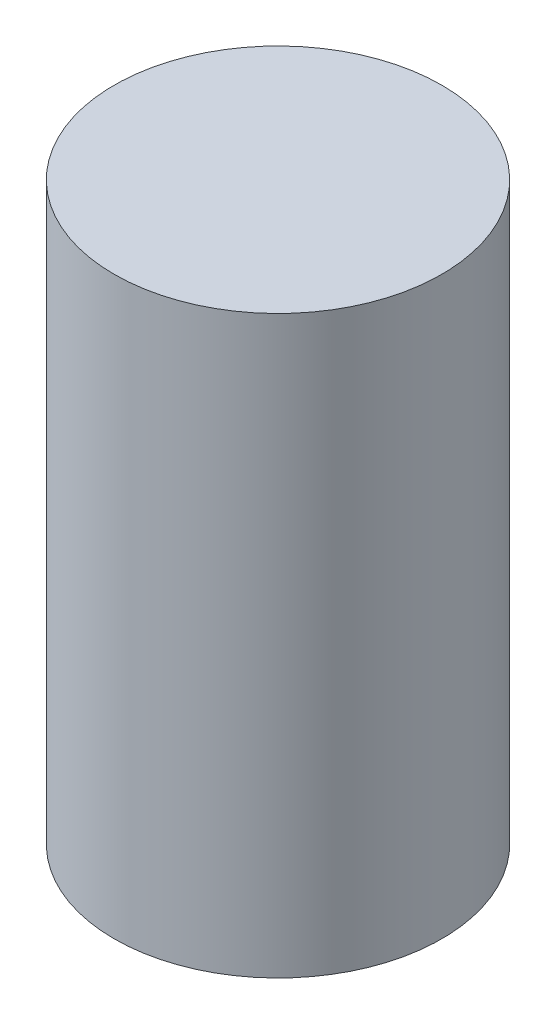
ISO-10303-21;
HEADER;
FILE_DESCRIPTION(('STEP AP214'),'2;1');
FILE_NAME('part.step','',(''),(''),'','','');
FILE_SCHEMA(('AUTOMOTIVE_DESIGN { 1 0 10303 214 1 1 1 1 }'));
ENDSEC;
DATA;
#1=APPLICATION_CONTEXT('core data for automotive mechanical design processes');
#2=APPLICATION_PROTOCOL_DEFINITION('international standard','automotive_design',2000,#1);
#3=PRODUCT_CONTEXT('',#1,'mechanical');
#4=PRODUCT('Part','Part','',(#3));
#5=PRODUCT_RELATED_PRODUCT_CATEGORY('part','',(#4));
#6=PRODUCT_DEFINITION_FORMATION('','',#4);
#7=PRODUCT_DEFINITION_CONTEXT('part definition',#1,'design');
#8=PRODUCT_DEFINITION('design','',#6,#7);
#9=PRODUCT_DEFINITION_SHAPE('','',#8);
#10=(LENGTH_UNIT() NAMED_UNIT(*) SI_UNIT(.MILLI.,.METRE.));
#11=(NAMED_UNIT(*) PLANE_ANGLE_UNIT() SI_UNIT($,.RADIAN.));
#12=(NAMED_UNIT(*) SI_UNIT($,.STERADIAN.) SOLID_ANGLE_UNIT());
#13=UNCERTAINTY_MEASURE_WITH_UNIT(LENGTH_MEASURE(1.E-05),#10,'distance_accuracy_value','');
#14=(GEOMETRIC_REPRESENTATION_CONTEXT(3) GLOBAL_UNCERTAINTY_ASSIGNED_CONTEXT((#13)) GLOBAL_UNIT_ASSIGNED_CONTEXT((#10,
#11,#12)) REPRESENTATION_CONTEXT('',''));
#15=CARTESIAN_POINT('',(0.,0.,0.));
#16=DIRECTION('',(0.,0.,1.));
#17=DIRECTION('',(1.,0.,0.));
#18=AXIS2_PLACEMENT_3D('',#15,#16,#17);
#19=CARTESIAN_POINT('',(0.,304.8,0.));
#20=DIRECTION('',(0.,-1.,0.));
#21=DIRECTION('',(0.,0.,-1.));
#22=AXIS2_PLACEMENT_3D('',#19,#20,#21);
#23=CYLINDRICAL_SURFACE('',#22,86.7673528354065);
#24=CARTESIAN_POINT('',(0.,304.8,0.));
#25=DIRECTION('',(0.,1.,0.));
#26=DIRECTION('',(0.,0.,1.));
#27=AXIS2_PLACEMENT_3D('',#24,#25,#26);
#28=CIRCLE('',#27,86.7673528354065);
#29=CARTESIAN_POINT('',(0.,304.8,-86.7673528354065));
#30=VERTEX_POINT('',#29);
#31=EDGE_CURVE('E10',#30,#30,#28,.T.);
#32=CARTESIAN_POINT('',(0.,0.,0.));
#33=DIRECTION('',(0.,1.,0.));
#34=DIRECTION('',(0.,0.,1.));
#35=AXIS2_PLACEMENT_3D('',#32,#33,#34);
#36=CIRCLE('',#35,86.7673528354065);
#37=CARTESIAN_POINT('',(0.,0.,-86.7673528354065));
#38=VERTEX_POINT('',#37);
#39=EDGE_CURVE('E34',#38,#38,#36,.T.);
#40=CARTESIAN_POINT('',(0.,304.8,-86.7673528354065));
#41=CARTESIAN_POINT('',(0.,301.625,-86.7673528354065));
#42=CARTESIAN_POINT('',(0.,298.45,-86.7673528354065));
#43=CARTESIAN_POINT('',(0.,292.1,-86.7673528354065));
#44=CARTESIAN_POINT('',(0.,288.925,-86.7673528354065));
#45=CARTESIAN_POINT('',(0.,282.575,-86.7673528354065));
#46=CARTESIAN_POINT('',(0.,279.4,-86.7673528354065));
#47=CARTESIAN_POINT('',(0.,273.05,-86.7673528354065));
#48=CARTESIAN_POINT('',(0.,269.875,-86.7673528354065));
#49=CARTESIAN_POINT('',(0.,263.525,-86.7673528354065));
#50=CARTESIAN_POINT('',(0.,260.35,-86.7673528354065));
#51=CARTESIAN_POINT('',(0.,254.,-86.7673528354065));
#52=CARTESIAN_POINT('',(0.,250.825,-86.7673528354065));
#53=CARTESIAN_POINT('',(0.,244.475,-86.7673528354065));
#54=CARTESIAN_POINT('',(0.,241.3,-86.7673528354065));
#55=CARTESIAN_POINT('',(0.,234.95,-86.7673528354065));
#56=CARTESIAN_POINT('',(0.,231.775,-86.7673528354065));
#57=CARTESIAN_POINT('',(0.,225.425,-86.7673528354065));
#58=CARTESIAN_POINT('',(0.,222.25,-86.7673528354065));
#59=CARTESIAN_POINT('',(0.,215.9,-86.7673528354065));
#60=CARTESIAN_POINT('',(0.,212.725,-86.7673528354065));
#61=CARTESIAN_POINT('',(0.,206.375,-86.7673528354065));
#62=CARTESIAN_POINT('',(0.,203.2,-86.7673528354065));
#63=CARTESIAN_POINT('',(0.,196.85,-86.7673528354065));
#64=CARTESIAN_POINT('',(0.,193.675,-86.7673528354065));
#65=CARTESIAN_POINT('',(0.,187.325,-86.7673528354065));
#66=CARTESIAN_POINT('',(0.,184.15,-86.7673528354065));
#67=CARTESIAN_POINT('',(0.,177.8,-86.7673528354065));
#68=CARTESIAN_POINT('',(0.,174.625,-86.7673528354065));
#69=CARTESIAN_POINT('',(0.,168.275,-86.7673528354065));
#70=CARTESIAN_POINT('',(0.,165.1,-86.7673528354065));
#71=CARTESIAN_POINT('',(0.,158.75,-86.7673528354065));
#72=CARTESIAN_POINT('',(0.,155.575,-86.7673528354065));
#73=CARTESIAN_POINT('',(0.,149.225,-86.7673528354065));
#74=CARTESIAN_POINT('',(0.,146.05,-86.7673528354065));
#75=CARTESIAN_POINT('',(0.,139.7,-86.7673528354065));
#76=CARTESIAN_POINT('',(0.,136.525,-86.7673528354065));
#77=CARTESIAN_POINT('',(0.,130.175,-86.7673528354065));
#78=CARTESIAN_POINT('',(0.,127.,-86.7673528354065));
#79=CARTESIAN_POINT('',(0.,120.65,-86.7673528354065));
#80=CARTESIAN_POINT('',(0.,117.475,-86.7673528354065));
#81=CARTESIAN_POINT('',(0.,111.125,-86.7673528354065));
#82=CARTESIAN_POINT('',(0.,107.95,-86.7673528354065));
#83=CARTESIAN_POINT('',(0.,101.6,-86.7673528354065));
#84=CARTESIAN_POINT('',(0.,98.425,-86.7673528354065));
#85=CARTESIAN_POINT('',(0.,92.075,-86.7673528354065));
#86=CARTESIAN_POINT('',(0.,88.9,-86.7673528354065));
#87=CARTESIAN_POINT('',(0.,82.55,-86.7673528354065));
#88=CARTESIAN_POINT('',(0.,79.375,-86.7673528354065));
#89=CARTESIAN_POINT('',(0.,73.025,-86.7673528354065));
#90=CARTESIAN_POINT('',(0.,69.85,-86.7673528354065));
#91=CARTESIAN_POINT('',(0.,63.5,-86.7673528354065));
#92=CARTESIAN_POINT('',(0.,60.325,-86.7673528354065));
#93=CARTESIAN_POINT('',(0.,53.975,-86.7673528354065));
#94=CARTESIAN_POINT('',(0.,50.8,-86.7673528354065));
#95=CARTESIAN_POINT('',(0.,44.45,-86.7673528354065));
#96=CARTESIAN_POINT('',(0.,41.275,-86.7673528354065));
#97=CARTESIAN_POINT('',(0.,34.925,-86.7673528354065));
#98=CARTESIAN_POINT('',(0.,31.75,-86.7673528354065));
#99=CARTESIAN_POINT('',(0.,25.4,-86.7673528354065));
#100=CARTESIAN_POINT('',(0.,22.225,-86.7673528354065));
#101=CARTESIAN_POINT('',(0.,15.875,-86.7673528354065));
#102=CARTESIAN_POINT('',(0.,12.7,-86.7673528354065));
#103=CARTESIAN_POINT('',(0.,6.35,-86.7673528354065));
#104=CARTESIAN_POINT('',(0.,3.175,-86.7673528354065));
#105=CARTESIAN_POINT('',(0.,0.,-86.7673528354065));
#106=B_SPLINE_CURVE_WITH_KNOTS('',3,(#40,#41,#42,#43,#44,#45,#46,#47,#48,#49,#50,#51,#52,#53,
#54,#55,#56,#57,#58,#59,#60,#61,#62,#63,#64,#65,#66,#67,#68,#69,#70,#71,#72,#73,#74,#75,#76,#77,
#78,#79,#80,#81,#82,#83,#84,#85,#86,#87,#88,#89,#90,#91,#92,#93,#94,#95,#96,#97,#98,#99,#100,
#101,#102,#103,#104,#105),.UNSPECIFIED.,.F.,.F.,(4,2,2,2,2,2,2,2,2,2,2,2,2,2,2,2,2,2,2,2,2,2,2,
2,2,2,2,2,2,2,2,2,4),(0.,9.52499999999995,19.05,28.575,38.1,47.625,57.15,66.675,76.2,85.725,
95.2499999999999,104.775,114.3,123.825,133.35,142.875,152.4,161.925,171.45,180.975,190.5,
200.025,209.55,219.075,228.6,238.125,247.65,257.175,266.7,276.225,285.75,295.275,304.8),.UNSPECIFIED.);
#107=EDGE_CURVE('BSEAM31',#30,#38,#106,.T.);
#108=ORIENTED_EDGE('',*,*,#31,.F.);
#109=ORIENTED_EDGE('',*,*,#39,.T.);
#110=ORIENTED_EDGE('',*,*,#107,.T.);
#111=ORIENTED_EDGE('',*,*,#107,.F.);
#112=EDGE_LOOP('',(#108,#110,#109,#111));
#113=FACE_BOUND('',#112,.T.);
#114=ADVANCED_FACE('F31',(#113),#23,.T.);
#115=CARTESIAN_POINT('',(0.,304.8,0.));
#116=DIRECTION('',(0.,1.,0.));
#117=DIRECTION('',(0.,0.,1.));
#118=AXIS2_PLACEMENT_3D('',#115,#116,#117);
#119=PLANE('',#118);
#120=ORIENTED_EDGE('',*,*,#31,.T.);
#121=EDGE_LOOP('',(#120));
#122=FACE_BOUND('',#121,.T.);
#123=ADVANCED_FACE('F46',(#122),#119,.T.);
#124=CARTESIAN_POINT('',(0.,0.,0.));
#125=DIRECTION('',(0.,1.,0.));
#126=DIRECTION('',(0.,0.,1.));
#127=AXIS2_PLACEMENT_3D('',#124,#125,#126);
#128=PLANE('',#127);
#129=ORIENTED_EDGE('',*,*,#39,.F.);
#130=EDGE_LOOP('',(#129));
#131=FACE_BOUND('',#130,.T.);
#132=ADVANCED_FACE('F44',(#131),#128,.F.);
#133=CLOSED_SHELL('',(#114,#123,#132));
#134=MANIFOLD_SOLID_BREP('B2',#133);
#135=ADVANCED_BREP_SHAPE_REPRESENTATION('',(#18,#134),#14);
#136=SHAPE_DEFINITION_REPRESENTATION(#9,#135);
ENDSEC;
END-ISO-10303-21;
